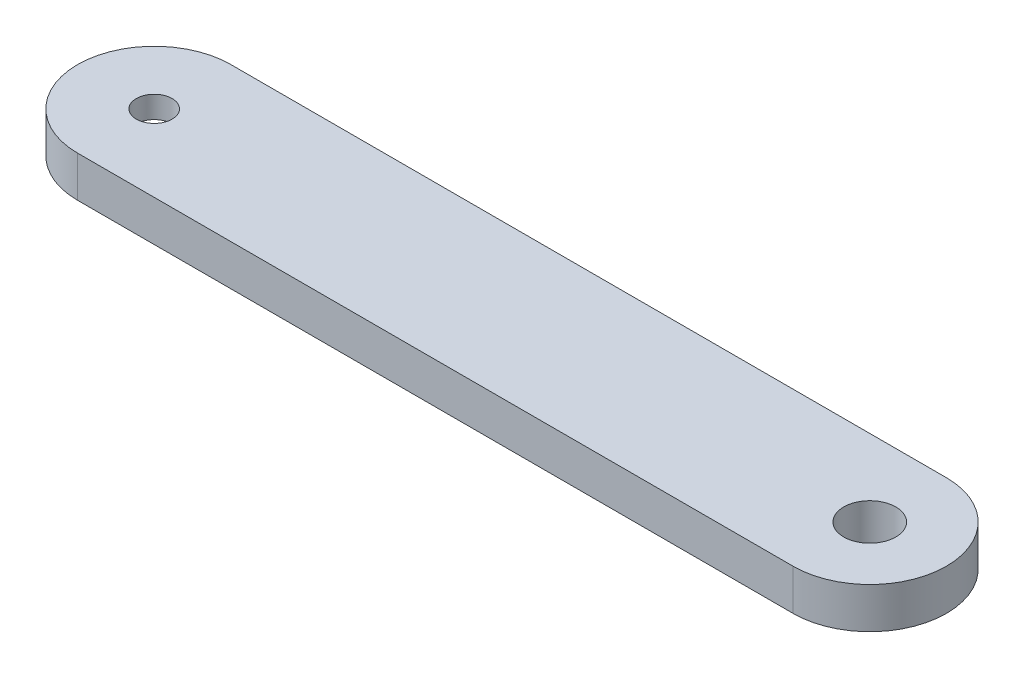
ISO-10303-21;
HEADER;
FILE_DESCRIPTION(('STEP AP214'),'2;1');
FILE_NAME('part.step','',(''),(''),'','','');
FILE_SCHEMA(('AUTOMOTIVE_DESIGN { 1 0 10303 214 1 1 1 1 }'));
ENDSEC;
DATA;
#1=APPLICATION_CONTEXT('core data for automotive mechanical design processes');
#2=APPLICATION_PROTOCOL_DEFINITION('international standard','automotive_design',2000,#1);
#3=PRODUCT_CONTEXT('',#1,'mechanical');
#4=PRODUCT('Part','Part','',(#3));
#5=PRODUCT_RELATED_PRODUCT_CATEGORY('part','',(#4));
#6=PRODUCT_DEFINITION_FORMATION('','',#4);
#7=PRODUCT_DEFINITION_CONTEXT('part definition',#1,'design');
#8=PRODUCT_DEFINITION('design','',#6,#7);
#9=PRODUCT_DEFINITION_SHAPE('','',#8);
#10=(LENGTH_UNIT() NAMED_UNIT(*) SI_UNIT(.MILLI.,.METRE.));
#11=(NAMED_UNIT(*) PLANE_ANGLE_UNIT() SI_UNIT($,.RADIAN.));
#12=(NAMED_UNIT(*) SI_UNIT($,.STERADIAN.) SOLID_ANGLE_UNIT());
#13=UNCERTAINTY_MEASURE_WITH_UNIT(LENGTH_MEASURE(1.E-05),#10,'distance_accuracy_value','');
#14=(GEOMETRIC_REPRESENTATION_CONTEXT(3) GLOBAL_UNCERTAINTY_ASSIGNED_CONTEXT((#13)) GLOBAL_UNIT_ASSIGNED_CONTEXT((#10,
#11,#12)) REPRESENTATION_CONTEXT('',''));
#15=CARTESIAN_POINT('',(0.,0.,0.));
#16=DIRECTION('',(0.,0.,1.));
#17=DIRECTION('',(1.,0.,0.));
#18=AXIS2_PLACEMENT_3D('',#15,#16,#17);
#19=CARTESIAN_POINT('',(-70.,8.,0.));
#20=DIRECTION('',(0.,-1.,0.));
#21=DIRECTION('',(0.,0.,-1.));
#22=AXIS2_PLACEMENT_3D('',#19,#20,#21);
#23=CYLINDRICAL_SURFACE('',#22,3.50000000000001);
#24=CARTESIAN_POINT('',(-70.,8.,0.));
#25=DIRECTION('',(0.,1.,0.));
#26=DIRECTION('',(0.,0.,1.));
#27=AXIS2_PLACEMENT_3D('',#24,#25,#26);
#28=CIRCLE('',#27,3.50000000000001);
#29=CARTESIAN_POINT('',(-70.,8.,3.50000000000001));
#30=VERTEX_POINT('',#29);
#31=EDGE_CURVE('E124',#30,#30,#28,.T.);
#32=ORIENTED_EDGE('',*,*,#31,.T.);
#33=EDGE_LOOP('',(#32));
#34=FACE_BOUND('',#33,.T.);
#35=CARTESIAN_POINT('',(-70.,3.7,0.));
#36=DIRECTION('',(0.,-1.,0.));
#37=DIRECTION('',(0.,0.,-1.));
#38=AXIS2_PLACEMENT_3D('',#35,#36,#37);
#39=CIRCLE('',#38,3.50000000000001);
#40=CARTESIAN_POINT('',(-70.,3.7,-3.50000000000001));
#41=VERTEX_POINT('',#40);
#42=EDGE_CURVE('E43',#41,#41,#39,.T.);
#43=ORIENTED_EDGE('',*,*,#42,.T.);
#44=EDGE_LOOP('',(#43));
#45=FACE_BOUND('',#44,.T.);
#46=ADVANCED_FACE('F39',(#34,#45),#23,.F.);
#47=CARTESIAN_POINT('',(70.,8.,0.));
#48=DIRECTION('',(0.,1.,0.));
#49=DIRECTION('',(0.,0.,1.));
#50=AXIS2_PLACEMENT_3D('',#47,#48,#49);
#51=PLANE('',#50);
#52=CARTESIAN_POINT('',(70.,8.,0.));
#53=DIRECTION('',(0.,1.,0.));
#54=DIRECTION('',(0.,0.,1.));
#55=AXIS2_PLACEMENT_3D('',#52,#53,#54);
#56=CIRCLE('',#55,5.1);
#57=CARTESIAN_POINT('',(70.,8.,5.1));
#58=VERTEX_POINT('',#57);
#59=EDGE_CURVE('E108',#58,#58,#56,.T.);
#60=ORIENTED_EDGE('',*,*,#59,.F.);
#61=EDGE_LOOP('',(#60));
#62=FACE_BOUND('',#61,.T.);
#63=CARTESIAN_POINT('',(70.,8.,0.));
#64=DIRECTION('',(0.,1.,0.));
#65=DIRECTION('',(0.,0.,1.));
#66=AXIS2_PLACEMENT_3D('',#63,#64,#65);
#67=CIRCLE('',#66,15.);
#68=CARTESIAN_POINT('',(70.,8.,15.));
#69=VERTEX_POINT('',#68);
#70=CARTESIAN_POINT('',(70.,8.,-15.));
#71=VERTEX_POINT('',#70);
#72=EDGE_CURVE('E91',#69,#71,#67,.T.);
#73=ORIENTED_EDGE('',*,*,#72,.T.);
#74=DIRECTION('',(-1.,0.,0.));
#75=VECTOR('',#74,1.);
#76=CARTESIAN_POINT('',(70.,8.,-15.));
#77=LINE('',#76,#75);
#78=CARTESIAN_POINT('',(-70.,8.,-15.));
#79=VERTEX_POINT('',#78);
#80=EDGE_CURVE('E87',#71,#79,#77,.T.);
#81=ORIENTED_EDGE('',*,*,#80,.T.);
#82=CARTESIAN_POINT('',(-70.,8.,0.));
#83=DIRECTION('',(0.,1.,0.));
#84=DIRECTION('',(0.,0.,1.));
#85=AXIS2_PLACEMENT_3D('',#82,#83,#84);
#86=CIRCLE('',#85,15.);
#87=CARTESIAN_POINT('',(-70.,8.,15.));
#88=VERTEX_POINT('',#87);
#89=EDGE_CURVE('E93',#79,#88,#86,.T.);
#90=ORIENTED_EDGE('',*,*,#89,.T.);
#91=DIRECTION('',(1.,0.,0.));
#92=VECTOR('',#91,1.);
#93=CARTESIAN_POINT('',(70.,8.,15.));
#94=LINE('',#93,#92);
#95=EDGE_CURVE('E60',#88,#69,#94,.T.);
#96=ORIENTED_EDGE('',*,*,#95,.T.);
#97=EDGE_LOOP('',(#73,#81,#90,#96));
#98=FACE_BOUND('',#97,.T.);
#99=ORIENTED_EDGE('',*,*,#31,.F.);
#100=EDGE_LOOP('',(#99));
#101=FACE_BOUND('',#100,.T.);
#102=ADVANCED_FACE('F86',(#62,#98,#101),#51,.T.);
#103=CARTESIAN_POINT('',(70.,0.,0.));
#104=DIRECTION('',(0.,1.,0.));
#105=DIRECTION('',(0.,0.,1.));
#106=AXIS2_PLACEMENT_3D('',#103,#104,#105);
#107=PLANE('',#106);
#108=CARTESIAN_POINT('',(-70.,0.,0.));
#109=DIRECTION('',(0.,-1.,0.));
#110=DIRECTION('',(0.,0.,-1.));
#111=AXIS2_PLACEMENT_3D('',#108,#109,#110);
#112=CIRCLE('',#111,11.);
#113=CARTESIAN_POINT('',(-70.,0.,-11.));
#114=VERTEX_POINT('',#113);
#115=EDGE_CURVE('E129',#114,#114,#112,.T.);
#116=ORIENTED_EDGE('',*,*,#115,.F.);
#117=EDGE_LOOP('',(#116));
#118=FACE_BOUND('',#117,.T.);
#119=CARTESIAN_POINT('',(70.,0.,0.));
#120=DIRECTION('',(0.,1.,0.));
#121=DIRECTION('',(0.,0.,1.));
#122=AXIS2_PLACEMENT_3D('',#119,#120,#121);
#123=CIRCLE('',#122,15.);
#124=CARTESIAN_POINT('',(70.,0.,15.));
#125=VERTEX_POINT('',#124);
#126=CARTESIAN_POINT('',(70.,0.,-15.));
#127=VERTEX_POINT('',#126);
#128=EDGE_CURVE('E106',#125,#127,#123,.T.);
#129=ORIENTED_EDGE('',*,*,#128,.F.);
#130=DIRECTION('',(1.,0.,0.));
#131=VECTOR('',#130,1.);
#132=CARTESIAN_POINT('',(70.,0.,15.));
#133=LINE('',#132,#131);
#134=CARTESIAN_POINT('',(-70.,0.,15.));
#135=VERTEX_POINT('',#134);
#136=EDGE_CURVE('E78',#135,#125,#133,.T.);
#137=ORIENTED_EDGE('',*,*,#136,.F.);
#138=CARTESIAN_POINT('',(-70.,0.,0.));
#139=DIRECTION('',(0.,1.,0.));
#140=DIRECTION('',(0.,0.,1.));
#141=AXIS2_PLACEMENT_3D('',#138,#139,#140);
#142=CIRCLE('',#141,15.);
#143=CARTESIAN_POINT('',(-70.,0.,-15.));
#144=VERTEX_POINT('',#143);
#145=EDGE_CURVE('E74',#144,#135,#142,.T.);
#146=ORIENTED_EDGE('',*,*,#145,.F.);
#147=DIRECTION('',(-1.,0.,0.));
#148=VECTOR('',#147,1.);
#149=CARTESIAN_POINT('',(70.,0.,-15.));
#150=LINE('',#149,#148);
#151=EDGE_CURVE('E100',#127,#144,#150,.T.);
#152=ORIENTED_EDGE('',*,*,#151,.F.);
#153=EDGE_LOOP('',(#129,#137,#146,#152));
#154=FACE_BOUND('',#153,.T.);
#155=CARTESIAN_POINT('',(70.,0.,0.));
#156=DIRECTION('',(0.,1.,0.));
#157=DIRECTION('',(0.,0.,1.));
#158=AXIS2_PLACEMENT_3D('',#155,#156,#157);
#159=CIRCLE('',#158,5.1);
#160=CARTESIAN_POINT('',(70.,0.,5.1));
#161=VERTEX_POINT('',#160);
#162=EDGE_CURVE('E123',#161,#161,#159,.T.);
#163=ORIENTED_EDGE('',*,*,#162,.T.);
#164=EDGE_LOOP('',(#163));
#165=FACE_BOUND('',#164,.T.);
#166=ADVANCED_FACE('F120',(#118,#154,#165),#107,.F.);
#167=CARTESIAN_POINT('',(70.,8.,0.));
#168=DIRECTION('',(0.,-1.,0.));
#169=DIRECTION('',(0.,0.,-1.));
#170=AXIS2_PLACEMENT_3D('',#167,#168,#169);
#171=CYLINDRICAL_SURFACE('',#170,15.);
#172=ORIENTED_EDGE('',*,*,#128,.T.);
#173=DIRECTION('',(0.,-1.,0.));
#174=VECTOR('',#173,1.);
#175=CARTESIAN_POINT('',(70.,8.,-15.));
#176=LINE('',#175,#174);
#177=EDGE_CURVE('E11',#71,#127,#176,.T.);
#178=ORIENTED_EDGE('',*,*,#177,.F.);
#179=ORIENTED_EDGE('',*,*,#72,.F.);
#180=DIRECTION('',(0.,-1.,0.));
#181=VECTOR('',#180,1.);
#182=CARTESIAN_POINT('',(70.,8.,15.));
#183=LINE('',#182,#181);
#184=EDGE_CURVE('E105',#69,#125,#183,.T.);
#185=ORIENTED_EDGE('',*,*,#184,.T.);
#186=EDGE_LOOP('',(#172,#178,#179,#185));
#187=FACE_BOUND('',#186,.T.);
#188=ADVANCED_FACE('F41',(#187),#171,.T.);
#189=CARTESIAN_POINT('',(70.,8.,-15.));
#190=DIRECTION('',(0.,0.,1.));
#191=DIRECTION('',(1.,0.,0.));
#192=AXIS2_PLACEMENT_3D('',#189,#190,#191);
#193=PLANE('',#192);
#194=ORIENTED_EDGE('',*,*,#151,.T.);
#195=DIRECTION('',(0.,-1.,0.));
#196=VECTOR('',#195,1.);
#197=CARTESIAN_POINT('',(-70.,8.,-15.));
#198=LINE('',#197,#196);
#199=EDGE_CURVE('E47',#79,#144,#198,.T.);
#200=ORIENTED_EDGE('',*,*,#199,.F.);
#201=ORIENTED_EDGE('',*,*,#80,.F.);
#202=ORIENTED_EDGE('',*,*,#177,.T.);
#203=EDGE_LOOP('',(#194,#200,#201,#202));
#204=FACE_BOUND('',#203,.T.);
#205=ADVANCED_FACE('F96',(#204),#193,.F.);
#206=CARTESIAN_POINT('',(-70.,8.,0.));
#207=DIRECTION('',(0.,-1.,0.));
#208=DIRECTION('',(0.,0.,-1.));
#209=AXIS2_PLACEMENT_3D('',#206,#207,#208);
#210=CYLINDRICAL_SURFACE('',#209,15.);
#211=ORIENTED_EDGE('',*,*,#145,.T.);
#212=DIRECTION('',(0.,-1.,0.));
#213=VECTOR('',#212,1.);
#214=CARTESIAN_POINT('',(-70.,8.,15.));
#215=LINE('',#214,#213);
#216=EDGE_CURVE('E98',#88,#135,#215,.T.);
#217=ORIENTED_EDGE('',*,*,#216,.F.);
#218=ORIENTED_EDGE('',*,*,#89,.F.);
#219=ORIENTED_EDGE('',*,*,#199,.T.);
#220=EDGE_LOOP('',(#211,#217,#218,#219));
#221=FACE_BOUND('',#220,.T.);
#222=ADVANCED_FACE('F99',(#221),#210,.T.);
#223=CARTESIAN_POINT('',(70.,8.,15.));
#224=DIRECTION('',(0.,0.,-1.));
#225=DIRECTION('',(-1.,0.,0.));
#226=AXIS2_PLACEMENT_3D('',#223,#224,#225);
#227=PLANE('',#226);
#228=ORIENTED_EDGE('',*,*,#136,.T.);
#229=ORIENTED_EDGE('',*,*,#184,.F.);
#230=ORIENTED_EDGE('',*,*,#95,.F.);
#231=ORIENTED_EDGE('',*,*,#216,.T.);
#232=EDGE_LOOP('',(#228,#229,#230,#231));
#233=FACE_BOUND('',#232,.T.);
#234=ADVANCED_FACE('F111',(#233),#227,.F.);
#235=CARTESIAN_POINT('',(70.,8.,0.));
#236=DIRECTION('',(0.,-1.,0.));
#237=DIRECTION('',(0.,0.,-1.));
#238=AXIS2_PLACEMENT_3D('',#235,#236,#237);
#239=CYLINDRICAL_SURFACE('',#238,5.1);
#240=ORIENTED_EDGE('',*,*,#59,.T.);
#241=EDGE_LOOP('',(#240));
#242=FACE_BOUND('',#241,.T.);
#243=ORIENTED_EDGE('',*,*,#162,.F.);
#244=EDGE_LOOP('',(#243));
#245=FACE_BOUND('',#244,.T.);
#246=ADVANCED_FACE('F176',(#242,#245),#239,.F.);
#247=CARTESIAN_POINT('',(-70.,3.7,0.));
#248=DIRECTION('',(0.,-1.,0.));
#249=DIRECTION('',(0.,0.,-1.));
#250=AXIS2_PLACEMENT_3D('',#247,#248,#249);
#251=CYLINDRICAL_SURFACE('',#250,11.);
#252=CARTESIAN_POINT('',(-70.,3.7,0.));
#253=DIRECTION('',(0.,-1.,0.));
#254=DIRECTION('',(0.,0.,-1.));
#255=AXIS2_PLACEMENT_3D('',#252,#253,#254);
#256=CIRCLE('',#255,11.);
#257=CARTESIAN_POINT('',(-70.,3.7,-11.));
#258=VERTEX_POINT('',#257);
#259=EDGE_CURVE('E135',#258,#258,#256,.T.);
#260=ORIENTED_EDGE('',*,*,#259,.F.);
#261=EDGE_LOOP('',(#260));
#262=FACE_BOUND('',#261,.T.);
#263=ORIENTED_EDGE('',*,*,#115,.T.);
#264=EDGE_LOOP('',(#263));
#265=FACE_BOUND('',#264,.T.);
#266=ADVANCED_FACE('F167',(#262,#265),#251,.F.);
#267=CARTESIAN_POINT('',(-70.,3.7,0.));
#268=DIRECTION('',(0.,-1.,0.));
#269=DIRECTION('',(0.,0.,-1.));
#270=AXIS2_PLACEMENT_3D('',#267,#268,#269);
#271=PLANE('',#270);
#272=CARTESIAN_POINT('',(-75.66,3.7,-5.66));
#273=DIRECTION('',(0.,-1.,0.));
#274=DIRECTION('',(0.,0.,1.));
#275=AXIS2_PLACEMENT_3D('',#272,#273,#274);
#276=CIRCLE('',#275,1.10000000000001);
#277=CARTESIAN_POINT('',(-75.66,3.7,-4.55999999999999));
#278=VERTEX_POINT('',#277);
#279=EDGE_CURVE('E144',#278,#278,#276,.T.);
#280=ORIENTED_EDGE('',*,*,#279,.F.);
#281=EDGE_LOOP('',(#280));
#282=FACE_BOUND('',#281,.T.);
#283=CARTESIAN_POINT('',(-64.34,3.7,-5.66));
#284=DIRECTION('',(0.,-1.,0.));
#285=DIRECTION('',(0.,0.,-1.));
#286=AXIS2_PLACEMENT_3D('',#283,#284,#285);
#287=CIRCLE('',#286,1.10000000000001);
#288=CARTESIAN_POINT('',(-64.34,3.7,-6.76000000000001));
#289=VERTEX_POINT('',#288);
#290=EDGE_CURVE('E151',#289,#289,#287,.T.);
#291=ORIENTED_EDGE('',*,*,#290,.F.);
#292=EDGE_LOOP('',(#291));
#293=FACE_BOUND('',#292,.T.);
#294=CARTESIAN_POINT('',(-64.34,3.7,5.66));
#295=DIRECTION('',(0.,-1.,0.));
#296=DIRECTION('',(0.,0.,1.));
#297=AXIS2_PLACEMENT_3D('',#294,#295,#296);
#298=CIRCLE('',#297,1.10000000000001);
#299=CARTESIAN_POINT('',(-64.34,3.7,6.76000000000001));
#300=VERTEX_POINT('',#299);
#301=EDGE_CURVE('E139',#300,#300,#298,.T.);
#302=ORIENTED_EDGE('',*,*,#301,.F.);
#303=EDGE_LOOP('',(#302));
#304=FACE_BOUND('',#303,.T.);
#305=CARTESIAN_POINT('',(-75.66,3.7,5.66));
#306=DIRECTION('',(0.,-1.,0.));
#307=DIRECTION('',(0.,0.,-1.));
#308=AXIS2_PLACEMENT_3D('',#305,#306,#307);
#309=CIRCLE('',#308,1.10000000000001);
#310=CARTESIAN_POINT('',(-75.66,3.7,4.55999999999999));
#311=VERTEX_POINT('',#310);
#312=EDGE_CURVE('E138',#311,#311,#309,.T.);
#313=ORIENTED_EDGE('',*,*,#312,.F.);
#314=EDGE_LOOP('',(#313));
#315=FACE_BOUND('',#314,.T.);
#316=ORIENTED_EDGE('',*,*,#42,.F.);
#317=EDGE_LOOP('',(#316));
#318=FACE_BOUND('',#317,.T.);
#319=ORIENTED_EDGE('',*,*,#259,.T.);
#320=EDGE_LOOP('',(#319));
#321=FACE_BOUND('',#320,.T.);
#322=ADVANCED_FACE('F165',(#282,#293,#304,#315,#318,#321),#271,.T.);
#323=CARTESIAN_POINT('',(-75.66,6.7,5.66));
#324=DIRECTION('',(0.,-1.,0.));
#325=DIRECTION('',(0.,0.,-1.));
#326=AXIS2_PLACEMENT_3D('',#323,#324,#325);
#327=CYLINDRICAL_SURFACE('',#326,1.10000000000001);
#328=CARTESIAN_POINT('',(-75.66,6.7,5.66));
#329=DIRECTION('',(0.,-1.,0.));
#330=DIRECTION('',(0.,0.,-1.));
#331=AXIS2_PLACEMENT_3D('',#328,#329,#330);
#332=CIRCLE('',#331,1.10000000000001);
#333=CARTESIAN_POINT('',(-75.66,6.7,4.55999999999999));
#334=VERTEX_POINT('',#333);
#335=EDGE_CURVE('E134',#334,#334,#332,.T.);
#336=ORIENTED_EDGE('',*,*,#335,.F.);
#337=EDGE_LOOP('',(#336));
#338=FACE_BOUND('',#337,.T.);
#339=ORIENTED_EDGE('',*,*,#312,.T.);
#340=EDGE_LOOP('',(#339));
#341=FACE_BOUND('',#340,.T.);
#342=ADVANCED_FACE('F164',(#338,#341),#327,.F.);
#343=CARTESIAN_POINT('',(-75.66,6.7,5.66));
#344=DIRECTION('',(0.,-1.,0.));
#345=DIRECTION('',(0.,0.,-1.));
#346=AXIS2_PLACEMENT_3D('',#343,#344,#345);
#347=PLANE('',#346);
#348=ORIENTED_EDGE('',*,*,#335,.T.);
#349=EDGE_LOOP('',(#348));
#350=FACE_BOUND('',#349,.T.);
#351=ADVANCED_FACE('F255',(#350),#347,.T.);
#352=CARTESIAN_POINT('',(-64.34,6.7,5.66));
#353=DIRECTION('',(0.,-1.,0.));
#354=DIRECTION('',(0.,0.,-1.));
#355=AXIS2_PLACEMENT_3D('',#352,#353,#354);
#356=CYLINDRICAL_SURFACE('',#355,1.10000000000001);
#357=CARTESIAN_POINT('',(-64.34,6.7,5.66));
#358=DIRECTION('',(0.,-1.,0.));
#359=DIRECTION('',(0.,0.,1.));
#360=AXIS2_PLACEMENT_3D('',#357,#358,#359);
#361=CIRCLE('',#360,1.10000000000001);
#362=CARTESIAN_POINT('',(-64.34,6.7,6.76000000000001));
#363=VERTEX_POINT('',#362);
#364=EDGE_CURVE('E152',#363,#363,#361,.T.);
#365=ORIENTED_EDGE('',*,*,#364,.F.);
#366=EDGE_LOOP('',(#365));
#367=FACE_BOUND('',#366,.T.);
#368=ORIENTED_EDGE('',*,*,#301,.T.);
#369=EDGE_LOOP('',(#368));
#370=FACE_BOUND('',#369,.T.);
#371=ADVANCED_FACE('F159',(#367,#370),#356,.F.);
#372=CARTESIAN_POINT('',(-64.34,6.7,5.66));
#373=DIRECTION('',(0.,1.,0.));
#374=DIRECTION('',(0.,0.,1.));
#375=AXIS2_PLACEMENT_3D('',#372,#373,#374);
#376=PLANE('',#375);
#377=ORIENTED_EDGE('',*,*,#364,.T.);
#378=EDGE_LOOP('',(#377));
#379=FACE_BOUND('',#378,.T.);
#380=ADVANCED_FACE('F272',(#379),#376,.F.);
#381=CARTESIAN_POINT('',(-64.34,6.7,-5.66));
#382=DIRECTION('',(0.,-1.,0.));
#383=DIRECTION('',(0.,0.,-1.));
#384=AXIS2_PLACEMENT_3D('',#381,#382,#383);
#385=CYLINDRICAL_SURFACE('',#384,1.10000000000001);
#386=CARTESIAN_POINT('',(-64.34,6.7,-5.66));
#387=DIRECTION('',(0.,-1.,0.));
#388=DIRECTION('',(0.,0.,-1.));
#389=AXIS2_PLACEMENT_3D('',#386,#387,#388);
#390=CIRCLE('',#389,1.10000000000001);
#391=CARTESIAN_POINT('',(-64.34,6.7,-6.76000000000001));
#392=VERTEX_POINT('',#391);
#393=EDGE_CURVE('E146',#392,#392,#390,.T.);
#394=ORIENTED_EDGE('',*,*,#393,.F.);
#395=EDGE_LOOP('',(#394));
#396=FACE_BOUND('',#395,.T.);
#397=ORIENTED_EDGE('',*,*,#290,.T.);
#398=EDGE_LOOP('',(#397));
#399=FACE_BOUND('',#398,.T.);
#400=ADVANCED_FACE('F284',(#396,#399),#385,.F.);
#401=CARTESIAN_POINT('',(-64.34,6.7,-5.66));
#402=DIRECTION('',(0.,-1.,0.));
#403=DIRECTION('',(0.,0.,-1.));
#404=AXIS2_PLACEMENT_3D('',#401,#402,#403);
#405=PLANE('',#404);
#406=ORIENTED_EDGE('',*,*,#393,.T.);
#407=EDGE_LOOP('',(#406));
#408=FACE_BOUND('',#407,.T.);
#409=ADVANCED_FACE('F291',(#408),#405,.T.);
#410=CARTESIAN_POINT('',(-75.66,6.7,-5.66));
#411=DIRECTION('',(0.,-1.,0.));
#412=DIRECTION('',(0.,0.,-1.));
#413=AXIS2_PLACEMENT_3D('',#410,#411,#412);
#414=CYLINDRICAL_SURFACE('',#413,1.10000000000001);
#415=CARTESIAN_POINT('',(-75.66,6.7,-5.66));
#416=DIRECTION('',(0.,-1.,0.));
#417=DIRECTION('',(0.,0.,1.));
#418=AXIS2_PLACEMENT_3D('',#415,#416,#417);
#419=CIRCLE('',#418,1.10000000000001);
#420=CARTESIAN_POINT('',(-75.66,6.7,-4.55999999999999));
#421=VERTEX_POINT('',#420);
#422=EDGE_CURVE('E142',#421,#421,#419,.T.);
#423=ORIENTED_EDGE('',*,*,#422,.F.);
#424=EDGE_LOOP('',(#423));
#425=FACE_BOUND('',#424,.T.);
#426=ORIENTED_EDGE('',*,*,#279,.T.);
#427=EDGE_LOOP('',(#426));
#428=FACE_BOUND('',#427,.T.);
#429=ADVANCED_FACE('F301',(#425,#428),#414,.F.);
#430=CARTESIAN_POINT('',(-75.66,6.7,-5.66));
#431=DIRECTION('',(0.,1.,0.));
#432=DIRECTION('',(0.,0.,1.));
#433=AXIS2_PLACEMENT_3D('',#430,#431,#432);
#434=PLANE('',#433);
#435=ORIENTED_EDGE('',*,*,#422,.T.);
#436=EDGE_LOOP('',(#435));
#437=FACE_BOUND('',#436,.T.);
#438=ADVANCED_FACE('F311',(#437),#434,.F.);
#439=CLOSED_SHELL('',(#46,#102,#166,#188,#205,#222,#234,#246,#266,#322,#342,#351,#371,#380,#400,
#409,#429,#438));
#440=MANIFOLD_SOLID_BREP('B2',#439);
#441=ADVANCED_BREP_SHAPE_REPRESENTATION('',(#18,#440),#14);
#442=SHAPE_DEFINITION_REPRESENTATION(#9,#441);
ENDSEC;
END-ISO-10303-21;
